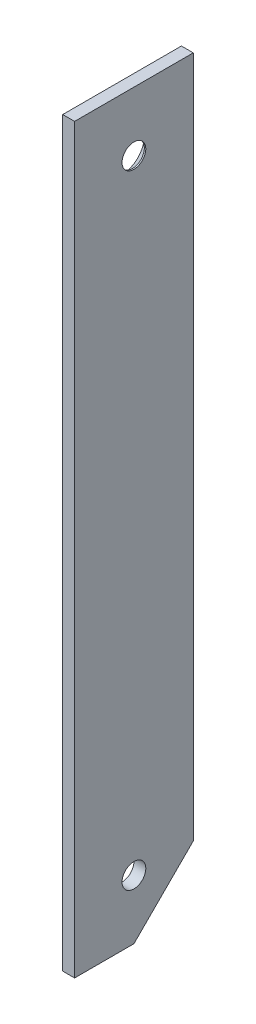
ISO-10303-21;
HEADER;
FILE_DESCRIPTION(('STEP AP214'),'2;1');
FILE_NAME('part.step','',(''),(''),'','','');
FILE_SCHEMA(('AUTOMOTIVE_DESIGN { 1 0 10303 214 1 1 1 1 }'));
ENDSEC;
DATA;
#1=APPLICATION_CONTEXT('core data for automotive mechanical design processes');
#2=APPLICATION_PROTOCOL_DEFINITION('international standard','automotive_design',2000,#1);
#3=PRODUCT_CONTEXT('',#1,'mechanical');
#4=PRODUCT('Part','Part','',(#3));
#5=PRODUCT_RELATED_PRODUCT_CATEGORY('part','',(#4));
#6=PRODUCT_DEFINITION_FORMATION('','',#4);
#7=PRODUCT_DEFINITION_CONTEXT('part definition',#1,'design');
#8=PRODUCT_DEFINITION('design','',#6,#7);
#9=PRODUCT_DEFINITION_SHAPE('','',#8);
#10=(LENGTH_UNIT() NAMED_UNIT(*) SI_UNIT(.MILLI.,.METRE.));
#11=(NAMED_UNIT(*) PLANE_ANGLE_UNIT() SI_UNIT($,.RADIAN.));
#12=(NAMED_UNIT(*) SI_UNIT($,.STERADIAN.) SOLID_ANGLE_UNIT());
#13=UNCERTAINTY_MEASURE_WITH_UNIT(LENGTH_MEASURE(1.E-05),#10,'distance_accuracy_value','');
#14=(GEOMETRIC_REPRESENTATION_CONTEXT(3) GLOBAL_UNCERTAINTY_ASSIGNED_CONTEXT((#13)) GLOBAL_UNIT_ASSIGNED_CONTEXT((#10,
#11,#12)) REPRESENTATION_CONTEXT('',''));
#15=CARTESIAN_POINT('',(0.,0.,0.));
#16=DIRECTION('',(0.,0.,1.));
#17=DIRECTION('',(1.,0.,0.));
#18=AXIS2_PLACEMENT_3D('',#15,#16,#17);
#19=CARTESIAN_POINT('',(4.,0.,0.));
#20=DIRECTION('',(1.,0.,0.));
#21=DIRECTION('',(0.,0.,-1.));
#22=AXIS2_PLACEMENT_3D('',#19,#20,#21);
#23=PLANE('',#22);
#24=CARTESIAN_POINT('',(4.,105.,0.));
#25=DIRECTION('',(1.,0.,0.));
#26=DIRECTION('',(0.,0.,-1.));
#27=AXIS2_PLACEMENT_3D('',#24,#25,#26);
#28=CIRCLE('',#27,4.00000000000001);
#29=CARTESIAN_POINT('',(4.,105.,-3.99999999999998));
#30=VERTEX_POINT('',#29);
#31=EDGE_CURVE('E125',#30,#30,#28,.T.);
#32=ORIENTED_EDGE('',*,*,#31,.F.);
#33=EDGE_LOOP('',(#32));
#34=FACE_BOUND('',#33,.T.);
#35=DIRECTION('',(0.,0.,-1.));
#36=VECTOR('',#35,1.);
#37=CARTESIAN_POINT('',(4.,-125.,20.));
#38=LINE('',#37,#36);
#39=CARTESIAN_POINT('',(4.,-125.,20.));
#40=VERTEX_POINT('',#39);
#41=CARTESIAN_POINT('',(4.,-125.,0.));
#42=VERTEX_POINT('',#41);
#43=EDGE_CURVE('E133',#40,#42,#38,.T.);
#44=ORIENTED_EDGE('',*,*,#43,.T.);
#45=DIRECTION('',(0.,-0.707106781186546,0.707106781186549));
#46=VECTOR('',#45,1.);
#47=CARTESIAN_POINT('',(4.,-62.5000000000002,-62.4999999999999));
#48=LINE('',#47,#46);
#49=CARTESIAN_POINT('',(4.,-105.,-20.));
#50=VERTEX_POINT('',#49);
#51=EDGE_CURVE('E11',#42,#50,#48,.F.);
#52=ORIENTED_EDGE('',*,*,#51,.T.);
#53=DIRECTION('',(0.,1.,0.));
#54=VECTOR('',#53,1.);
#55=CARTESIAN_POINT('',(4.,125.,-20.));
#56=LINE('',#55,#54);
#57=CARTESIAN_POINT('',(4.,125.,-20.));
#58=VERTEX_POINT('',#57);
#59=EDGE_CURVE('E83',#50,#58,#56,.T.);
#60=ORIENTED_EDGE('',*,*,#59,.T.);
#61=DIRECTION('',(0.,0.,1.));
#62=VECTOR('',#61,1.);
#63=CARTESIAN_POINT('',(4.,125.,20.));
#64=LINE('',#63,#62);
#65=CARTESIAN_POINT('',(4.,125.,20.));
#66=VERTEX_POINT('',#65);
#67=EDGE_CURVE('E86',#58,#66,#64,.T.);
#68=ORIENTED_EDGE('',*,*,#67,.T.);
#69=DIRECTION('',(0.,-1.,0.));
#70=VECTOR('',#69,1.);
#71=CARTESIAN_POINT('',(4.,125.,20.));
#72=LINE('',#71,#70);
#73=EDGE_CURVE('E102',#66,#40,#72,.T.);
#74=ORIENTED_EDGE('',*,*,#73,.T.);
#75=EDGE_LOOP('',(#44,#52,#60,#68,#74));
#76=FACE_BOUND('',#75,.T.);
#77=CARTESIAN_POINT('',(4.,-105.,0.));
#78=DIRECTION('',(1.,0.,0.));
#79=DIRECTION('',(0.,0.,-1.));
#80=AXIS2_PLACEMENT_3D('',#77,#78,#79);
#81=CIRCLE('',#80,4.00000000000001);
#82=CARTESIAN_POINT('',(4.,-105.,-4.00000000000004));
#83=VERTEX_POINT('',#82);
#84=EDGE_CURVE('E130',#83,#83,#81,.T.);
#85=ORIENTED_EDGE('',*,*,#84,.F.);
#86=EDGE_LOOP('',(#85));
#87=FACE_BOUND('',#86,.T.);
#88=ADVANCED_FACE('F37',(#34,#76,#87),#23,.T.);
#89=CARTESIAN_POINT('',(0.,0.,0.));
#90=DIRECTION('',(1.,0.,0.));
#91=DIRECTION('',(0.,0.,-1.));
#92=AXIS2_PLACEMENT_3D('',#89,#90,#91);
#93=PLANE('',#92);
#94=CARTESIAN_POINT('',(0.,105.,0.));
#95=DIRECTION('',(1.,0.,0.));
#96=DIRECTION('',(0.,0.,-1.));
#97=AXIS2_PLACEMENT_3D('',#94,#95,#96);
#98=CIRCLE('',#97,7.49999999999998);
#99=CARTESIAN_POINT('',(0.,105.,-7.49999999999995));
#100=VERTEX_POINT('',#99);
#101=EDGE_CURVE('E107',#100,#100,#98,.T.);
#102=ORIENTED_EDGE('',*,*,#101,.T.);
#103=EDGE_LOOP('',(#102));
#104=FACE_BOUND('',#103,.T.);
#105=DIRECTION('',(0.,1.,0.));
#106=VECTOR('',#105,1.);
#107=CARTESIAN_POINT('',(0.,125.,-20.));
#108=LINE('',#107,#106);
#109=CARTESIAN_POINT('',(0.,-105.,-20.));
#110=VERTEX_POINT('',#109);
#111=CARTESIAN_POINT('',(0.,125.,-20.));
#112=VERTEX_POINT('',#111);
#113=EDGE_CURVE('E105',#110,#112,#108,.T.);
#114=ORIENTED_EDGE('',*,*,#113,.F.);
#115=DIRECTION('',(0.,0.707106781186546,-0.707106781186549));
#116=VECTOR('',#115,1.);
#117=CARTESIAN_POINT('',(0.,-105.,-20.));
#118=LINE('',#117,#116);
#119=CARTESIAN_POINT('',(0.,-125.,0.));
#120=VERTEX_POINT('',#119);
#121=EDGE_CURVE('E59',#110,#120,#118,.F.);
#122=ORIENTED_EDGE('',*,*,#121,.T.);
#123=DIRECTION('',(0.,0.,-1.));
#124=VECTOR('',#123,1.);
#125=CARTESIAN_POINT('',(0.,-125.,20.));
#126=LINE('',#125,#124);
#127=CARTESIAN_POINT('',(0.,-125.,20.));
#128=VERTEX_POINT('',#127);
#129=EDGE_CURVE('E93',#128,#120,#126,.T.);
#130=ORIENTED_EDGE('',*,*,#129,.F.);
#131=DIRECTION('',(0.,-1.,0.));
#132=VECTOR('',#131,1.);
#133=CARTESIAN_POINT('',(0.,125.,20.));
#134=LINE('',#133,#132);
#135=CARTESIAN_POINT('',(0.,125.,20.));
#136=VERTEX_POINT('',#135);
#137=EDGE_CURVE('E127',#136,#128,#134,.T.);
#138=ORIENTED_EDGE('',*,*,#137,.F.);
#139=DIRECTION('',(0.,0.,1.));
#140=VECTOR('',#139,1.);
#141=CARTESIAN_POINT('',(0.,125.,20.));
#142=LINE('',#141,#140);
#143=EDGE_CURVE('E124',#112,#136,#142,.T.);
#144=ORIENTED_EDGE('',*,*,#143,.F.);
#145=EDGE_LOOP('',(#114,#122,#130,#138,#144));
#146=FACE_BOUND('',#145,.T.);
#147=CARTESIAN_POINT('',(0.,-105.,0.));
#148=DIRECTION('',(1.,0.,0.));
#149=DIRECTION('',(0.,0.,-1.));
#150=AXIS2_PLACEMENT_3D('',#147,#148,#149);
#151=CIRCLE('',#150,4.00000000000001);
#152=CARTESIAN_POINT('',(0.,-105.,-4.00000000000004));
#153=VERTEX_POINT('',#152);
#154=EDGE_CURVE('E140',#153,#153,#151,.T.);
#155=ORIENTED_EDGE('',*,*,#154,.T.);
#156=EDGE_LOOP('',(#155));
#157=FACE_BOUND('',#156,.T.);
#158=ADVANCED_FACE('F121',(#104,#146,#157),#93,.F.);
#159=CARTESIAN_POINT('',(4.,125.,-20.));
#160=DIRECTION('',(0.,0.,1.));
#161=DIRECTION('',(0.,-1.,0.));
#162=AXIS2_PLACEMENT_3D('',#159,#160,#161);
#163=PLANE('',#162);
#164=ORIENTED_EDGE('',*,*,#59,.F.);
#165=DIRECTION('',(-1.,0.,0.));
#166=VECTOR('',#165,1.);
#167=CARTESIAN_POINT('',(4.,-105.,-20.));
#168=LINE('',#167,#166);
#169=EDGE_CURVE('E118',#50,#110,#168,.T.);
#170=ORIENTED_EDGE('',*,*,#169,.T.);
#171=ORIENTED_EDGE('',*,*,#113,.T.);
#172=DIRECTION('',(-1.,0.,0.));
#173=VECTOR('',#172,1.);
#174=CARTESIAN_POINT('',(4.,125.,-20.));
#175=LINE('',#174,#173);
#176=EDGE_CURVE('E98',#58,#112,#175,.T.);
#177=ORIENTED_EDGE('',*,*,#176,.F.);
#178=EDGE_LOOP('',(#164,#170,#171,#177));
#179=FACE_BOUND('',#178,.T.);
#180=ADVANCED_FACE('F104',(#179),#163,.F.);
#181=CARTESIAN_POINT('',(4.,125.,20.));
#182=DIRECTION('',(0.,-1.,0.));
#183=DIRECTION('',(0.,0.,-1.));
#184=AXIS2_PLACEMENT_3D('',#181,#182,#183);
#185=PLANE('',#184);
#186=ORIENTED_EDGE('',*,*,#143,.T.);
#187=DIRECTION('',(-1.,0.,0.));
#188=VECTOR('',#187,1.);
#189=CARTESIAN_POINT('',(4.,125.,20.));
#190=LINE('',#189,#188);
#191=EDGE_CURVE('E100',#66,#136,#190,.T.);
#192=ORIENTED_EDGE('',*,*,#191,.F.);
#193=ORIENTED_EDGE('',*,*,#67,.F.);
#194=ORIENTED_EDGE('',*,*,#176,.T.);
#195=EDGE_LOOP('',(#186,#192,#193,#194));
#196=FACE_BOUND('',#195,.T.);
#197=ADVANCED_FACE('F97',(#196),#185,.F.);
#198=CARTESIAN_POINT('',(4.,125.,20.));
#199=DIRECTION('',(0.,0.,-1.));
#200=DIRECTION('',(0.,1.,0.));
#201=AXIS2_PLACEMENT_3D('',#198,#199,#200);
#202=PLANE('',#201);
#203=ORIENTED_EDGE('',*,*,#137,.T.);
#204=DIRECTION('',(-1.,0.,0.));
#205=VECTOR('',#204,1.);
#206=CARTESIAN_POINT('',(4.,-125.,20.));
#207=LINE('',#206,#205);
#208=EDGE_CURVE('E112',#40,#128,#207,.T.);
#209=ORIENTED_EDGE('',*,*,#208,.F.);
#210=ORIENTED_EDGE('',*,*,#73,.F.);
#211=ORIENTED_EDGE('',*,*,#191,.T.);
#212=EDGE_LOOP('',(#203,#209,#210,#211));
#213=FACE_BOUND('',#212,.T.);
#214=ADVANCED_FACE('F164',(#213),#202,.F.);
#215=CARTESIAN_POINT('',(4.,-125.,20.));
#216=DIRECTION('',(0.,1.,0.));
#217=DIRECTION('',(0.,0.,1.));
#218=AXIS2_PLACEMENT_3D('',#215,#216,#217);
#219=PLANE('',#218);
#220=ORIENTED_EDGE('',*,*,#129,.T.);
#221=DIRECTION('',(1.,0.,0.));
#222=VECTOR('',#221,1.);
#223=CARTESIAN_POINT('',(4.,-125.,0.));
#224=LINE('',#223,#222);
#225=EDGE_CURVE('E45',#120,#42,#224,.T.);
#226=ORIENTED_EDGE('',*,*,#225,.T.);
#227=ORIENTED_EDGE('',*,*,#43,.F.);
#228=ORIENTED_EDGE('',*,*,#208,.T.);
#229=EDGE_LOOP('',(#220,#226,#227,#228));
#230=FACE_BOUND('',#229,.T.);
#231=ADVANCED_FACE('F161',(#230),#219,.F.);
#232=CARTESIAN_POINT('',(4.,105.,0.));
#233=DIRECTION('',(-1.,0.,0.));
#234=DIRECTION('',(0.,0.,1.));
#235=AXIS2_PLACEMENT_3D('',#232,#233,#234);
#236=CYLINDRICAL_SURFACE('',#235,4.00000000000001);
#237=CARTESIAN_POINT('',(3.49999999999999,105.,0.));
#238=DIRECTION('',(1.,0.,0.));
#239=DIRECTION('',(0.,0.,-1.));
#240=AXIS2_PLACEMENT_3D('',#237,#238,#239);
#241=CIRCLE('',#240,4.00000000000001);
#242=CARTESIAN_POINT('',(3.49999999999999,105.,-3.99999999999998));
#243=VERTEX_POINT('',#242);
#244=EDGE_CURVE('E110',#243,#243,#241,.F.);
#245=ORIENTED_EDGE('',*,*,#244,.T.);
#246=EDGE_LOOP('',(#245));
#247=FACE_BOUND('',#246,.T.);
#248=ORIENTED_EDGE('',*,*,#31,.T.);
#249=EDGE_LOOP('',(#248));
#250=FACE_BOUND('',#249,.T.);
#251=ADVANCED_FACE('F158',(#247,#250),#236,.F.);
#252=CARTESIAN_POINT('',(4.,-105.,0.));
#253=DIRECTION('',(-1.,0.,0.));
#254=DIRECTION('',(0.,0.,1.));
#255=AXIS2_PLACEMENT_3D('',#252,#253,#254);
#256=CYLINDRICAL_SURFACE('',#255,4.00000000000001);
#257=ORIENTED_EDGE('',*,*,#84,.T.);
#258=EDGE_LOOP('',(#257));
#259=FACE_BOUND('',#258,.T.);
#260=ORIENTED_EDGE('',*,*,#154,.F.);
#261=EDGE_LOOP('',(#260));
#262=FACE_BOUND('',#261,.T.);
#263=ADVANCED_FACE('F146',(#259,#262),#256,.F.);
#264=CARTESIAN_POINT('',(0.,105.,0.));
#265=DIRECTION('',(-1.,0.,0.));
#266=DIRECTION('',(0.,0.,1.));
#267=AXIS2_PLACEMENT_3D('',#264,#265,#266);
#268=CONICAL_SURFACE('',#267,7.49999999999998,0.785398163397446);
#269=ORIENTED_EDGE('',*,*,#244,.F.);
#270=EDGE_LOOP('',(#269));
#271=FACE_BOUND('',#270,.T.);
#272=ORIENTED_EDGE('',*,*,#101,.F.);
#273=EDGE_LOOP('',(#272));
#274=FACE_BOUND('',#273,.T.);
#275=ADVANCED_FACE('F171',(#271,#274),#268,.F.);
#276=CARTESIAN_POINT('',(4.,-105.,-20.));
#277=DIRECTION('',(0.,0.707106781186549,0.707106781186546));
#278=DIRECTION('',(-1.,0.,0.));
#279=AXIS2_PLACEMENT_3D('',#276,#277,#278);
#280=PLANE('',#279);
#281=ORIENTED_EDGE('',*,*,#51,.F.);
#282=ORIENTED_EDGE('',*,*,#225,.F.);
#283=ORIENTED_EDGE('',*,*,#121,.F.);
#284=ORIENTED_EDGE('',*,*,#169,.F.);
#285=EDGE_LOOP('',(#281,#282,#283,#284));
#286=FACE_BOUND('',#285,.T.);
#287=ADVANCED_FACE('F39',(#286),#280,.F.);
#288=CLOSED_SHELL('',(#88,#158,#180,#197,#214,#231,#251,#263,#275,#287));
#289=MANIFOLD_SOLID_BREP('B2',#288);
#290=ADVANCED_BREP_SHAPE_REPRESENTATION('',(#18,#289),#14);
#291=SHAPE_DEFINITION_REPRESENTATION(#9,#290);
ENDSEC;
END-ISO-10303-21;
